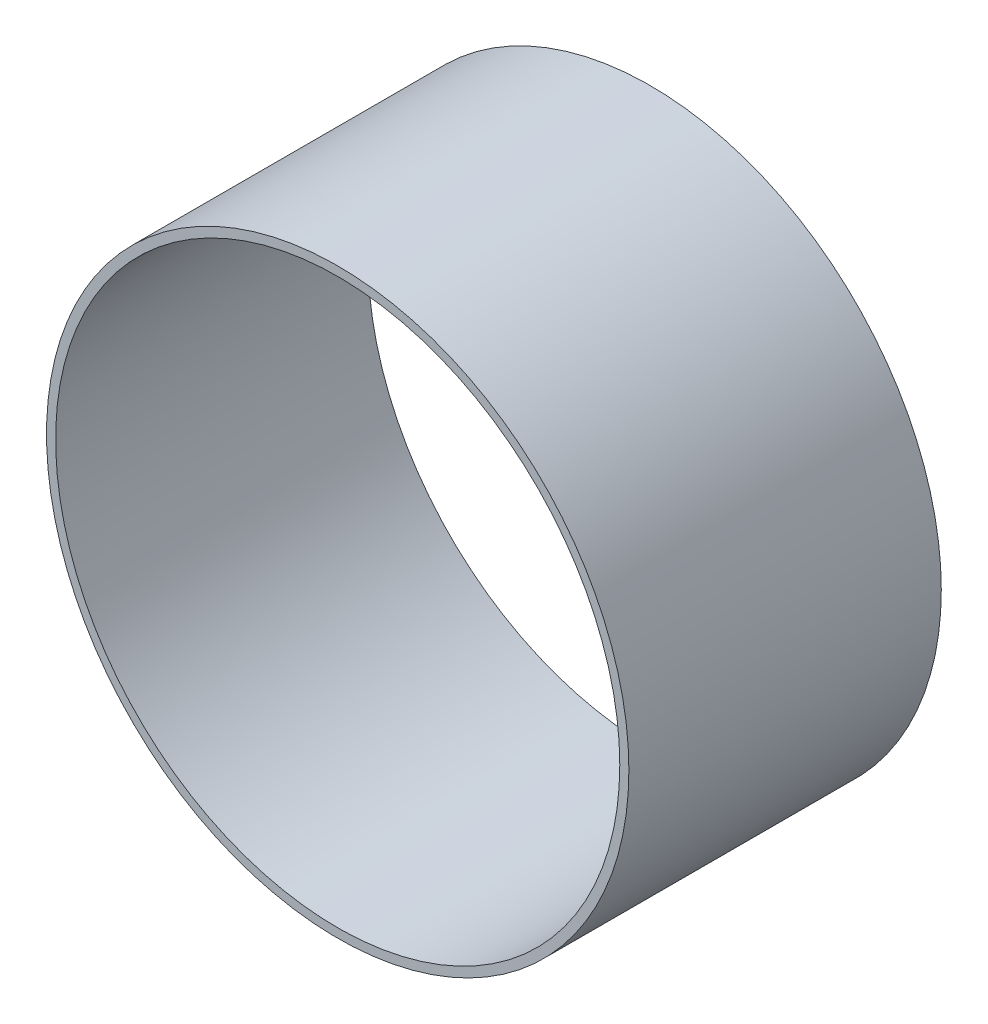
ISO-10303-21;
HEADER;
FILE_DESCRIPTION(('STEP AP214'),'2;1');
FILE_NAME('part.step','',(''),(''),'','','');
FILE_SCHEMA(('AUTOMOTIVE_DESIGN { 1 0 10303 214 1 1 1 1 }'));
ENDSEC;
DATA;
#1=APPLICATION_CONTEXT('core data for automotive mechanical design processes');
#2=APPLICATION_PROTOCOL_DEFINITION('international standard','automotive_design',2000,#1);
#3=PRODUCT_CONTEXT('',#1,'mechanical');
#4=PRODUCT('Part','Part','',(#3));
#5=PRODUCT_RELATED_PRODUCT_CATEGORY('part','',(#4));
#6=PRODUCT_DEFINITION_FORMATION('','',#4);
#7=PRODUCT_DEFINITION_CONTEXT('part definition',#1,'design');
#8=PRODUCT_DEFINITION('design','',#6,#7);
#9=PRODUCT_DEFINITION_SHAPE('','',#8);
#10=(LENGTH_UNIT() NAMED_UNIT(*) SI_UNIT(.MILLI.,.METRE.));
#11=(NAMED_UNIT(*) PLANE_ANGLE_UNIT() SI_UNIT($,.RADIAN.));
#12=(NAMED_UNIT(*) SI_UNIT($,.STERADIAN.) SOLID_ANGLE_UNIT());
#13=UNCERTAINTY_MEASURE_WITH_UNIT(LENGTH_MEASURE(1.E-05),#10,'distance_accuracy_value','');
#14=(GEOMETRIC_REPRESENTATION_CONTEXT(3) GLOBAL_UNCERTAINTY_ASSIGNED_CONTEXT((#13)) GLOBAL_UNIT_ASSIGNED_CONTEXT((#10,
#11,#12)) REPRESENTATION_CONTEXT('',''));
#15=CARTESIAN_POINT('',(0.,0.,0.));
#16=DIRECTION('',(0.,0.,1.));
#17=DIRECTION('',(1.,0.,0.));
#18=AXIS2_PLACEMENT_3D('',#15,#16,#17);
#19=CARTESIAN_POINT('',(0.,0.,58.5));
#20=DIRECTION('',(0.,0.,1.));
#21=DIRECTION('',(1.,0.,0.));
#22=AXIS2_PLACEMENT_3D('',#19,#20,#21);
#23=PLANE('',#22);
#24=CARTESIAN_POINT('',(0.,0.,58.5));
#25=DIRECTION('',(0.,0.,1.));
#26=DIRECTION('',(1.,0.,0.));
#27=AXIS2_PLACEMENT_3D('',#24,#25,#26);
#28=CIRCLE('',#27,96.);
#29=CARTESIAN_POINT('',(96.,0.,58.5));
#30=VERTEX_POINT('',#29);
#31=EDGE_CURVE('E10',#30,#30,#28,.T.);
#32=ORIENTED_EDGE('',*,*,#31,.T.);
#33=EDGE_LOOP('',(#32));
#34=FACE_BOUND('',#33,.T.);
#35=CARTESIAN_POINT('',(0.,0.,58.5));
#36=DIRECTION('',(0.,0.,1.));
#37=DIRECTION('',(1.,0.,0.));
#38=AXIS2_PLACEMENT_3D('',#35,#36,#37);
#39=CIRCLE('',#38,93.);
#40=CARTESIAN_POINT('',(93.,0.,58.5));
#41=VERTEX_POINT('',#40);
#42=EDGE_CURVE('E51',#41,#41,#39,.T.);
#43=ORIENTED_EDGE('',*,*,#42,.F.);
#44=EDGE_LOOP('',(#43));
#45=FACE_BOUND('',#44,.T.);
#46=ADVANCED_FACE('F36',(#34,#45),#23,.T.);
#47=CARTESIAN_POINT('',(0.,0.,-44.5));
#48=DIRECTION('',(0.,0.,1.));
#49=DIRECTION('',(1.,0.,0.));
#50=AXIS2_PLACEMENT_3D('',#47,#48,#49);
#51=PLANE('',#50);
#52=CARTESIAN_POINT('',(0.,0.,-44.5));
#53=DIRECTION('',(0.,0.,1.));
#54=DIRECTION('',(1.,0.,0.));
#55=AXIS2_PLACEMENT_3D('',#52,#53,#54);
#56=CIRCLE('',#55,96.);
#57=CARTESIAN_POINT('',(96.,0.,-44.5));
#58=VERTEX_POINT('',#57);
#59=EDGE_CURVE('E40',#58,#58,#56,.T.);
#60=ORIENTED_EDGE('',*,*,#59,.F.);
#61=EDGE_LOOP('',(#60));
#62=FACE_BOUND('',#61,.T.);
#63=CARTESIAN_POINT('',(0.,0.,-44.5));
#64=DIRECTION('',(0.,0.,1.));
#65=DIRECTION('',(1.,0.,0.));
#66=AXIS2_PLACEMENT_3D('',#63,#64,#65);
#67=CIRCLE('',#66,93.);
#68=CARTESIAN_POINT('',(93.,0.,-44.5));
#69=VERTEX_POINT('',#68);
#70=EDGE_CURVE('E53',#69,#69,#67,.T.);
#71=ORIENTED_EDGE('',*,*,#70,.T.);
#72=EDGE_LOOP('',(#71));
#73=FACE_BOUND('',#72,.T.);
#74=ADVANCED_FACE('F63',(#62,#73),#51,.F.);
#75=CARTESIAN_POINT('',(0.,0.,58.5));
#76=DIRECTION('',(0.,0.,-1.));
#77=DIRECTION('',(-1.,0.,0.));
#78=AXIS2_PLACEMENT_3D('',#75,#76,#77);
#79=CYLINDRICAL_SURFACE('',#78,96.);
#80=ORIENTED_EDGE('',*,*,#31,.F.);
#81=EDGE_LOOP('',(#80));
#82=FACE_BOUND('',#81,.T.);
#83=ORIENTED_EDGE('',*,*,#59,.T.);
#84=EDGE_LOOP('',(#83));
#85=FACE_BOUND('',#84,.T.);
#86=ADVANCED_FACE('F38',(#82,#85),#79,.T.);
#87=CARTESIAN_POINT('',(0.,0.,58.5));
#88=DIRECTION('',(0.,0.,-1.));
#89=DIRECTION('',(-1.,0.,0.));
#90=AXIS2_PLACEMENT_3D('',#87,#88,#89);
#91=CYLINDRICAL_SURFACE('',#90,93.);
#92=ORIENTED_EDGE('',*,*,#42,.T.);
#93=EDGE_LOOP('',(#92));
#94=FACE_BOUND('',#93,.T.);
#95=ORIENTED_EDGE('',*,*,#70,.F.);
#96=EDGE_LOOP('',(#95));
#97=FACE_BOUND('',#96,.T.);
#98=ADVANCED_FACE('F59',(#94,#97),#91,.F.);
#99=CLOSED_SHELL('',(#46,#74,#86,#98));
#100=MANIFOLD_SOLID_BREP('B2',#99);
#101=ADVANCED_BREP_SHAPE_REPRESENTATION('',(#18,#100),#14);
#102=SHAPE_DEFINITION_REPRESENTATION(#9,#101);
ENDSEC;
END-ISO-10303-21;
